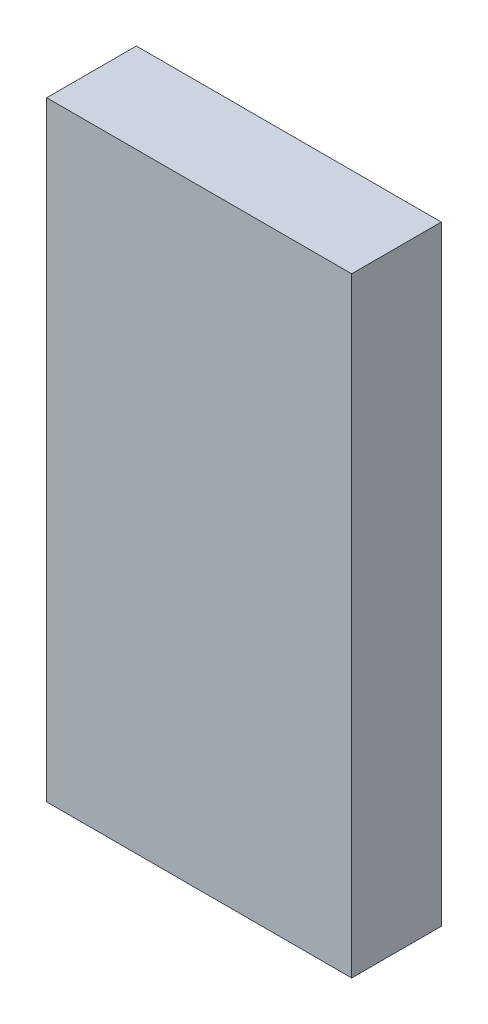
ISO-10303-21;
HEADER;
FILE_DESCRIPTION(('STEP AP214'),'2;1');
FILE_NAME('part.step','',(''),(''),'','','');
FILE_SCHEMA(('AUTOMOTIVE_DESIGN { 1 0 10303 214 1 1 1 1 }'));
ENDSEC;
DATA;
#1=APPLICATION_CONTEXT('core data for automotive mechanical design processes');
#2=APPLICATION_PROTOCOL_DEFINITION('international standard','automotive_design',2000,#1);
#3=PRODUCT_CONTEXT('',#1,'mechanical');
#4=PRODUCT('Part','Part','',(#3));
#5=PRODUCT_RELATED_PRODUCT_CATEGORY('part','',(#4));
#6=PRODUCT_DEFINITION_FORMATION('','',#4);
#7=PRODUCT_DEFINITION_CONTEXT('part definition',#1,'design');
#8=PRODUCT_DEFINITION('design','',#6,#7);
#9=PRODUCT_DEFINITION_SHAPE('','',#8);
#10=(LENGTH_UNIT() NAMED_UNIT(*) SI_UNIT(.MILLI.,.METRE.));
#11=(NAMED_UNIT(*) PLANE_ANGLE_UNIT() SI_UNIT($,.RADIAN.));
#12=(NAMED_UNIT(*) SI_UNIT($,.STERADIAN.) SOLID_ANGLE_UNIT());
#13=UNCERTAINTY_MEASURE_WITH_UNIT(LENGTH_MEASURE(1.E-05),#10,'distance_accuracy_value','');
#14=(GEOMETRIC_REPRESENTATION_CONTEXT(3) GLOBAL_UNCERTAINTY_ASSIGNED_CONTEXT((#13)) GLOBAL_UNIT_ASSIGNED_CONTEXT((#10,
#11,#12)) REPRESENTATION_CONTEXT('',''));
#15=CARTESIAN_POINT('',(0.,0.,0.));
#16=DIRECTION('',(0.,0.,1.));
#17=DIRECTION('',(1.,0.,0.));
#18=AXIS2_PLACEMENT_3D('',#15,#16,#17);
#19=CARTESIAN_POINT('',(122.5,-245.,72.));
#20=DIRECTION('',(-1.,0.,0.));
#21=DIRECTION('',(0.,0.,1.));
#22=AXIS2_PLACEMENT_3D('',#19,#20,#21);
#23=PLANE('',#22);
#24=DIRECTION('',(0.,1.,0.));
#25=VECTOR('',#24,1.);
#26=CARTESIAN_POINT('',(122.5,-245.,0.));
#27=LINE('',#26,#25);
#28=CARTESIAN_POINT('',(122.5,-245.,0.));
#29=VERTEX_POINT('',#28);
#30=CARTESIAN_POINT('',(122.5,245.,0.));
#31=VERTEX_POINT('',#30);
#32=EDGE_CURVE('E99',#29,#31,#27,.T.);
#33=ORIENTED_EDGE('',*,*,#32,.T.);
#34=DIRECTION('',(0.,0.,-1.));
#35=VECTOR('',#34,1.);
#36=CARTESIAN_POINT('',(122.5,245.,72.));
#37=LINE('',#36,#35);
#38=CARTESIAN_POINT('',(122.5,245.,72.));
#39=VERTEX_POINT('',#38);
#40=EDGE_CURVE('E11',#39,#31,#37,.T.);
#41=ORIENTED_EDGE('',*,*,#40,.F.);
#42=DIRECTION('',(0.,1.,0.));
#43=VECTOR('',#42,1.);
#44=CARTESIAN_POINT('',(122.5,-245.,72.));
#45=LINE('',#44,#43);
#46=CARTESIAN_POINT('',(122.5,-245.,72.));
#47=VERTEX_POINT('',#46);
#48=EDGE_CURVE('E85',#47,#39,#45,.T.);
#49=ORIENTED_EDGE('',*,*,#48,.F.);
#50=DIRECTION('',(0.,0.,-1.));
#51=VECTOR('',#50,1.);
#52=CARTESIAN_POINT('',(122.5,-245.,72.));
#53=LINE('',#52,#51);
#54=EDGE_CURVE('E52',#47,#29,#53,.T.);
#55=ORIENTED_EDGE('',*,*,#54,.T.);
#56=EDGE_LOOP('',(#33,#41,#49,#55));
#57=FACE_BOUND('',#56,.T.);
#58=ADVANCED_FACE('F36',(#57),#23,.F.);
#59=CARTESIAN_POINT('',(122.5,245.,72.));
#60=DIRECTION('',(0.,-1.,0.));
#61=DIRECTION('',(1.,0.,0.));
#62=AXIS2_PLACEMENT_3D('',#59,#60,#61);
#63=PLANE('',#62);
#64=DIRECTION('',(-1.,0.,0.));
#65=VECTOR('',#64,1.);
#66=CARTESIAN_POINT('',(122.5,245.,0.));
#67=LINE('',#66,#65);
#68=CARTESIAN_POINT('',(-122.5,245.,0.));
#69=VERTEX_POINT('',#68);
#70=EDGE_CURVE('E90',#31,#69,#67,.T.);
#71=ORIENTED_EDGE('',*,*,#70,.T.);
#72=DIRECTION('',(0.,0.,-1.));
#73=VECTOR('',#72,1.);
#74=CARTESIAN_POINT('',(-122.5,245.,72.));
#75=LINE('',#74,#73);
#76=CARTESIAN_POINT('',(-122.5,245.,72.));
#77=VERTEX_POINT('',#76);
#78=EDGE_CURVE('E44',#77,#69,#75,.T.);
#79=ORIENTED_EDGE('',*,*,#78,.F.);
#80=DIRECTION('',(-1.,0.,0.));
#81=VECTOR('',#80,1.);
#82=CARTESIAN_POINT('',(122.5,245.,72.));
#83=LINE('',#82,#81);
#84=EDGE_CURVE('E77',#39,#77,#83,.T.);
#85=ORIENTED_EDGE('',*,*,#84,.F.);
#86=ORIENTED_EDGE('',*,*,#40,.T.);
#87=EDGE_LOOP('',(#71,#79,#85,#86));
#88=FACE_BOUND('',#87,.T.);
#89=ADVANCED_FACE('F89',(#88),#63,.F.);
#90=CARTESIAN_POINT('',(-122.5,-245.,72.));
#91=DIRECTION('',(-1.,0.,0.));
#92=DIRECTION('',(0.,0.,1.));
#93=AXIS2_PLACEMENT_3D('',#90,#91,#92);
#94=PLANE('',#93);
#95=DIRECTION('',(0.,1.,0.));
#96=VECTOR('',#95,1.);
#97=CARTESIAN_POINT('',(-122.5,-245.,0.));
#98=LINE('',#97,#96);
#99=CARTESIAN_POINT('',(-122.5,-245.,0.));
#100=VERTEX_POINT('',#99);
#101=EDGE_CURVE('E102',#100,#69,#98,.T.);
#102=ORIENTED_EDGE('',*,*,#101,.F.);
#103=DIRECTION('',(0.,0.,-1.));
#104=VECTOR('',#103,1.);
#105=CARTESIAN_POINT('',(-122.5,-245.,72.));
#106=LINE('',#105,#104);
#107=CARTESIAN_POINT('',(-122.5,-245.,72.));
#108=VERTEX_POINT('',#107);
#109=EDGE_CURVE('E66',#108,#100,#106,.T.);
#110=ORIENTED_EDGE('',*,*,#109,.F.);
#111=DIRECTION('',(0.,1.,0.));
#112=VECTOR('',#111,1.);
#113=CARTESIAN_POINT('',(-122.5,-245.,72.));
#114=LINE('',#113,#112);
#115=EDGE_CURVE('E84',#108,#77,#114,.T.);
#116=ORIENTED_EDGE('',*,*,#115,.T.);
#117=ORIENTED_EDGE('',*,*,#78,.T.);
#118=EDGE_LOOP('',(#102,#110,#116,#117));
#119=FACE_BOUND('',#118,.T.);
#120=ADVANCED_FACE('F93',(#119),#94,.T.);
#121=CARTESIAN_POINT('',(122.5,-245.,72.));
#122=DIRECTION('',(0.,-1.,0.));
#123=DIRECTION('',(1.,0.,0.));
#124=AXIS2_PLACEMENT_3D('',#121,#122,#123);
#125=PLANE('',#124);
#126=DIRECTION('',(-1.,0.,0.));
#127=VECTOR('',#126,1.);
#128=CARTESIAN_POINT('',(122.5,-245.,0.));
#129=LINE('',#128,#127);
#130=EDGE_CURVE('E104',#29,#100,#129,.T.);
#131=ORIENTED_EDGE('',*,*,#130,.F.);
#132=ORIENTED_EDGE('',*,*,#54,.F.);
#133=DIRECTION('',(-1.,0.,0.));
#134=VECTOR('',#133,1.);
#135=CARTESIAN_POINT('',(122.5,-245.,72.));
#136=LINE('',#135,#134);
#137=EDGE_CURVE('E94',#47,#108,#136,.T.);
#138=ORIENTED_EDGE('',*,*,#137,.T.);
#139=ORIENTED_EDGE('',*,*,#109,.T.);
#140=EDGE_LOOP('',(#131,#132,#138,#139));
#141=FACE_BOUND('',#140,.T.);
#142=ADVANCED_FACE('F110',(#141),#125,.T.);
#143=CARTESIAN_POINT('',(0.,0.,72.));
#144=DIRECTION('',(0.,0.,1.));
#145=DIRECTION('',(1.,0.,0.));
#146=AXIS2_PLACEMENT_3D('',#143,#144,#145);
#147=PLANE('',#146);
#148=ORIENTED_EDGE('',*,*,#48,.T.);
#149=ORIENTED_EDGE('',*,*,#84,.T.);
#150=ORIENTED_EDGE('',*,*,#115,.F.);
#151=ORIENTED_EDGE('',*,*,#137,.F.);
#152=EDGE_LOOP('',(#148,#149,#150,#151));
#153=FACE_BOUND('',#152,.T.);
#154=ADVANCED_FACE('F81',(#153),#147,.T.);
#155=CARTESIAN_POINT('',(0.,0.,0.));
#156=DIRECTION('',(0.,0.,1.));
#157=DIRECTION('',(1.,0.,0.));
#158=AXIS2_PLACEMENT_3D('',#155,#156,#157);
#159=PLANE('',#158);
#160=ORIENTED_EDGE('',*,*,#32,.F.);
#161=ORIENTED_EDGE('',*,*,#130,.T.);
#162=ORIENTED_EDGE('',*,*,#101,.T.);
#163=ORIENTED_EDGE('',*,*,#70,.F.);
#164=EDGE_LOOP('',(#160,#161,#162,#163));
#165=FACE_BOUND('',#164,.T.);
#166=ADVANCED_FACE('F109',(#165),#159,.F.);
#167=CLOSED_SHELL('',(#58,#89,#120,#142,#154,#166));
#168=MANIFOLD_SOLID_BREP('B2',#167);
#169=ADVANCED_BREP_SHAPE_REPRESENTATION('',(#18,#168),#14);
#170=SHAPE_DEFINITION_REPRESENTATION(#9,#169);
ENDSEC;
END-ISO-10303-21;
